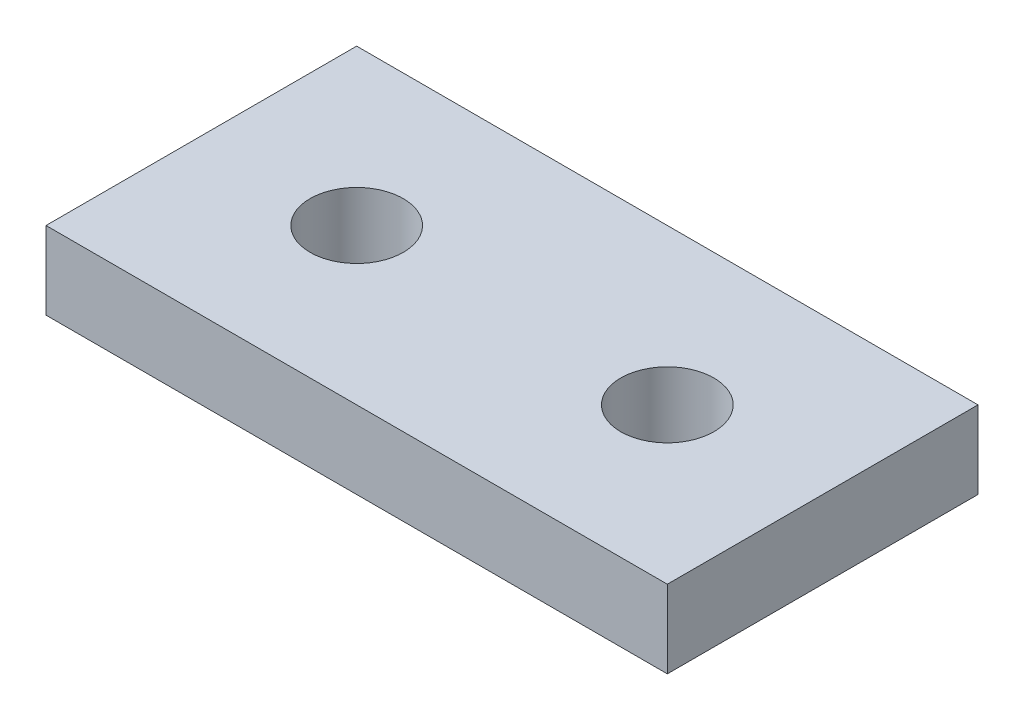
ISO-10303-21;
HEADER;
FILE_DESCRIPTION(('STEP AP214'),'2;1');
FILE_NAME('part.step','',(''),(''),'','','');
FILE_SCHEMA(('AUTOMOTIVE_DESIGN { 1 0 10303 214 1 1 1 1 }'));
ENDSEC;
DATA;
#1=APPLICATION_CONTEXT('core data for automotive mechanical design processes');
#2=APPLICATION_PROTOCOL_DEFINITION('international standard','automotive_design',2000,#1);
#3=PRODUCT_CONTEXT('',#1,'mechanical');
#4=PRODUCT('Part','Part','',(#3));
#5=PRODUCT_RELATED_PRODUCT_CATEGORY('part','',(#4));
#6=PRODUCT_DEFINITION_FORMATION('','',#4);
#7=PRODUCT_DEFINITION_CONTEXT('part definition',#1,'design');
#8=PRODUCT_DEFINITION('design','',#6,#7);
#9=PRODUCT_DEFINITION_SHAPE('','',#8);
#10=(LENGTH_UNIT() NAMED_UNIT(*) SI_UNIT(.MILLI.,.METRE.));
#11=(NAMED_UNIT(*) PLANE_ANGLE_UNIT() SI_UNIT($,.RADIAN.));
#12=(NAMED_UNIT(*) SI_UNIT($,.STERADIAN.) SOLID_ANGLE_UNIT());
#13=UNCERTAINTY_MEASURE_WITH_UNIT(LENGTH_MEASURE(1.E-05),#10,'distance_accuracy_value','');
#14=(GEOMETRIC_REPRESENTATION_CONTEXT(3) GLOBAL_UNCERTAINTY_ASSIGNED_CONTEXT((#13)) GLOBAL_UNIT_ASSIGNED_CONTEXT((#10,
#11,#12)) REPRESENTATION_CONTEXT('',''));
#15=CARTESIAN_POINT('',(0.,0.,0.));
#16=DIRECTION('',(0.,0.,1.));
#17=DIRECTION('',(1.,0.,0.));
#18=AXIS2_PLACEMENT_3D('',#15,#16,#17);
#19=CARTESIAN_POINT('',(0.,5.,0.));
#20=DIRECTION('',(0.,1.,0.));
#21=DIRECTION('',(0.,0.,1.));
#22=AXIS2_PLACEMENT_3D('',#19,#20,#21);
#23=PLANE('',#22);
#24=CARTESIAN_POINT('',(-21.25,5.,2.65625));
#25=DIRECTION('',(0.,1.,0.));
#26=DIRECTION('',(0.,0.,1.));
#27=AXIS2_PLACEMENT_3D('',#24,#25,#26);
#28=CIRCLE('',#27,3.);
#29=CARTESIAN_POINT('',(-21.25,5.,5.65625000000001));
#30=VERTEX_POINT('',#29);
#31=EDGE_CURVE('E100',#30,#30,#28,.T.);
#32=ORIENTED_EDGE('',*,*,#31,.F.);
#33=EDGE_LOOP('',(#32));
#34=FACE_BOUND('',#33,.T.);
#35=DIRECTION('',(0.,0.,1.));
#36=VECTOR('',#35,1.);
#37=CARTESIAN_POINT('',(-31.25,5.,-7.34375));
#38=LINE('',#37,#36);
#39=CARTESIAN_POINT('',(-31.25,5.,-7.34375));
#40=VERTEX_POINT('',#39);
#41=CARTESIAN_POINT('',(-31.25,5.,12.65625));
#42=VERTEX_POINT('',#41);
#43=EDGE_CURVE('E85',#40,#42,#38,.T.);
#44=ORIENTED_EDGE('',*,*,#43,.T.);
#45=DIRECTION('',(1.,0.,0.));
#46=VECTOR('',#45,1.);
#47=CARTESIAN_POINT('',(-31.25,5.,12.65625));
#48=LINE('',#47,#46);
#49=CARTESIAN_POINT('',(8.74999999999997,5.,12.65625));
#50=VERTEX_POINT('',#49);
#51=EDGE_CURVE('E80',#42,#50,#48,.T.);
#52=ORIENTED_EDGE('',*,*,#51,.T.);
#53=DIRECTION('',(0.,0.,-1.));
#54=VECTOR('',#53,1.);
#55=CARTESIAN_POINT('',(8.74999999999997,5.,-7.34375));
#56=LINE('',#55,#54);
#57=CARTESIAN_POINT('',(8.74999999999997,5.,-7.34375));
#58=VERTEX_POINT('',#57);
#59=EDGE_CURVE('E83',#50,#58,#56,.T.);
#60=ORIENTED_EDGE('',*,*,#59,.T.);
#61=DIRECTION('',(-1.,0.,0.));
#62=VECTOR('',#61,1.);
#63=CARTESIAN_POINT('',(-31.25,5.,-7.34375));
#64=LINE('',#63,#62);
#65=EDGE_CURVE('E50',#58,#40,#64,.T.);
#66=ORIENTED_EDGE('',*,*,#65,.T.);
#67=EDGE_LOOP('',(#44,#52,#60,#66));
#68=FACE_BOUND('',#67,.T.);
#69=CARTESIAN_POINT('',(-1.25000000000003,5.,2.65625));
#70=DIRECTION('',(0.,1.,0.));
#71=DIRECTION('',(0.,0.,1.));
#72=AXIS2_PLACEMENT_3D('',#69,#70,#71);
#73=CIRCLE('',#72,3.);
#74=CARTESIAN_POINT('',(-1.25000000000003,5.,5.65625000000001));
#75=VERTEX_POINT('',#74);
#76=EDGE_CURVE('E115',#75,#75,#73,.T.);
#77=ORIENTED_EDGE('',*,*,#76,.F.);
#78=EDGE_LOOP('',(#77));
#79=FACE_BOUND('',#78,.T.);
#80=ADVANCED_FACE('F33',(#34,#68,#79),#23,.T.);
#81=CARTESIAN_POINT('',(0.,0.,0.));
#82=DIRECTION('',(0.,1.,0.));
#83=DIRECTION('',(0.,0.,1.));
#84=AXIS2_PLACEMENT_3D('',#81,#82,#83);
#85=PLANE('',#84);
#86=DIRECTION('',(0.,0.,1.));
#87=VECTOR('',#86,1.);
#88=CARTESIAN_POINT('',(-31.25,0.,-7.34375));
#89=LINE('',#88,#87);
#90=CARTESIAN_POINT('',(-31.25,0.,-7.34375));
#91=VERTEX_POINT('',#90);
#92=CARTESIAN_POINT('',(-31.25,0.,12.65625));
#93=VERTEX_POINT('',#92);
#94=EDGE_CURVE('E97',#91,#93,#89,.T.);
#95=ORIENTED_EDGE('',*,*,#94,.F.);
#96=DIRECTION('',(-1.,0.,0.));
#97=VECTOR('',#96,1.);
#98=CARTESIAN_POINT('',(-31.25,0.,-7.34375));
#99=LINE('',#98,#97);
#100=CARTESIAN_POINT('',(8.74999999999997,0.,-7.34375));
#101=VERTEX_POINT('',#100);
#102=EDGE_CURVE('E73',#101,#91,#99,.T.);
#103=ORIENTED_EDGE('',*,*,#102,.F.);
#104=DIRECTION('',(0.,0.,-1.));
#105=VECTOR('',#104,1.);
#106=CARTESIAN_POINT('',(8.74999999999997,0.,-7.34375));
#107=LINE('',#106,#105);
#108=CARTESIAN_POINT('',(8.74999999999997,0.,12.65625));
#109=VERTEX_POINT('',#108);
#110=EDGE_CURVE('E67',#109,#101,#107,.T.);
#111=ORIENTED_EDGE('',*,*,#110,.F.);
#112=DIRECTION('',(1.,0.,0.));
#113=VECTOR('',#112,1.);
#114=CARTESIAN_POINT('',(-31.25,0.,12.65625));
#115=LINE('',#114,#113);
#116=EDGE_CURVE('E89',#93,#109,#115,.T.);
#117=ORIENTED_EDGE('',*,*,#116,.F.);
#118=EDGE_LOOP('',(#95,#103,#111,#117));
#119=FACE_BOUND('',#118,.T.);
#120=CARTESIAN_POINT('',(-21.25,0.,2.65625));
#121=DIRECTION('',(0.,1.,0.));
#122=DIRECTION('',(0.,0.,1.));
#123=AXIS2_PLACEMENT_3D('',#120,#121,#122);
#124=CIRCLE('',#123,3.);
#125=CARTESIAN_POINT('',(-21.25,0.,5.65625000000001));
#126=VERTEX_POINT('',#125);
#127=EDGE_CURVE('E112',#126,#126,#124,.T.);
#128=ORIENTED_EDGE('',*,*,#127,.T.);
#129=EDGE_LOOP('',(#128));
#130=FACE_BOUND('',#129,.T.);
#131=CARTESIAN_POINT('',(-1.25000000000003,0.,2.65625));
#132=DIRECTION('',(0.,1.,0.));
#133=DIRECTION('',(0.,0.,1.));
#134=AXIS2_PLACEMENT_3D('',#131,#132,#133);
#135=CIRCLE('',#134,3.);
#136=CARTESIAN_POINT('',(-1.25000000000003,0.,5.65625000000001));
#137=VERTEX_POINT('',#136);
#138=EDGE_CURVE('E118',#137,#137,#135,.T.);
#139=ORIENTED_EDGE('',*,*,#138,.T.);
#140=EDGE_LOOP('',(#139));
#141=FACE_BOUND('',#140,.T.);
#142=ADVANCED_FACE('F108',(#119,#130,#141),#85,.F.);
#143=CARTESIAN_POINT('',(-31.25,5.,-7.34375));
#144=DIRECTION('',(1.,0.,0.));
#145=DIRECTION('',(0.,0.,-1.));
#146=AXIS2_PLACEMENT_3D('',#143,#144,#145);
#147=PLANE('',#146);
#148=ORIENTED_EDGE('',*,*,#94,.T.);
#149=DIRECTION('',(0.,-1.,0.));
#150=VECTOR('',#149,1.);
#151=CARTESIAN_POINT('',(-31.25,5.,12.65625));
#152=LINE('',#151,#150);
#153=EDGE_CURVE('E11',#42,#93,#152,.T.);
#154=ORIENTED_EDGE('',*,*,#153,.F.);
#155=ORIENTED_EDGE('',*,*,#43,.F.);
#156=DIRECTION('',(0.,-1.,0.));
#157=VECTOR('',#156,1.);
#158=CARTESIAN_POINT('',(-31.25,5.,-7.34375));
#159=LINE('',#158,#157);
#160=EDGE_CURVE('E93',#40,#91,#159,.T.);
#161=ORIENTED_EDGE('',*,*,#160,.T.);
#162=EDGE_LOOP('',(#148,#154,#155,#161));
#163=FACE_BOUND('',#162,.T.);
#164=ADVANCED_FACE('F35',(#163),#147,.F.);
#165=CARTESIAN_POINT('',(-31.25,5.,12.65625));
#166=DIRECTION('',(0.,0.,-1.));
#167=DIRECTION('',(-1.,0.,0.));
#168=AXIS2_PLACEMENT_3D('',#165,#166,#167);
#169=PLANE('',#168);
#170=ORIENTED_EDGE('',*,*,#116,.T.);
#171=DIRECTION('',(0.,-1.,0.));
#172=VECTOR('',#171,1.);
#173=CARTESIAN_POINT('',(8.74999999999997,5.,12.65625));
#174=LINE('',#173,#172);
#175=EDGE_CURVE('E42',#50,#109,#174,.T.);
#176=ORIENTED_EDGE('',*,*,#175,.F.);
#177=ORIENTED_EDGE('',*,*,#51,.F.);
#178=ORIENTED_EDGE('',*,*,#153,.T.);
#179=EDGE_LOOP('',(#170,#176,#177,#178));
#180=FACE_BOUND('',#179,.T.);
#181=ADVANCED_FACE('F88',(#180),#169,.F.);
#182=CARTESIAN_POINT('',(8.74999999999997,5.,-7.34375));
#183=DIRECTION('',(-1.,0.,0.));
#184=DIRECTION('',(0.,0.,1.));
#185=AXIS2_PLACEMENT_3D('',#182,#183,#184);
#186=PLANE('',#185);
#187=ORIENTED_EDGE('',*,*,#110,.T.);
#188=DIRECTION('',(0.,-1.,0.));
#189=VECTOR('',#188,1.);
#190=CARTESIAN_POINT('',(8.74999999999997,5.,-7.34375));
#191=LINE('',#190,#189);
#192=EDGE_CURVE('E90',#58,#101,#191,.T.);
#193=ORIENTED_EDGE('',*,*,#192,.F.);
#194=ORIENTED_EDGE('',*,*,#59,.F.);
#195=ORIENTED_EDGE('',*,*,#175,.T.);
#196=EDGE_LOOP('',(#187,#193,#194,#195));
#197=FACE_BOUND('',#196,.T.);
#198=ADVANCED_FACE('F91',(#197),#186,.F.);
#199=CARTESIAN_POINT('',(-31.25,5.,-7.34375));
#200=DIRECTION('',(0.,0.,1.));
#201=DIRECTION('',(1.,0.,0.));
#202=AXIS2_PLACEMENT_3D('',#199,#200,#201);
#203=PLANE('',#202);
#204=ORIENTED_EDGE('',*,*,#102,.T.);
#205=ORIENTED_EDGE('',*,*,#160,.F.);
#206=ORIENTED_EDGE('',*,*,#65,.F.);
#207=ORIENTED_EDGE('',*,*,#192,.T.);
#208=EDGE_LOOP('',(#204,#205,#206,#207));
#209=FACE_BOUND('',#208,.T.);
#210=ADVANCED_FACE('F105',(#209),#203,.F.);
#211=CARTESIAN_POINT('',(-21.25,5.,2.65625));
#212=DIRECTION('',(0.,-1.,0.));
#213=DIRECTION('',(0.,0.,-1.));
#214=AXIS2_PLACEMENT_3D('',#211,#212,#213);
#215=CYLINDRICAL_SURFACE('',#214,3.);
#216=ORIENTED_EDGE('',*,*,#31,.T.);
#217=EDGE_LOOP('',(#216));
#218=FACE_BOUND('',#217,.T.);
#219=ORIENTED_EDGE('',*,*,#127,.F.);
#220=EDGE_LOOP('',(#219));
#221=FACE_BOUND('',#220,.T.);
#222=ADVANCED_FACE('F135',(#218,#221),#215,.F.);
#223=CARTESIAN_POINT('',(-1.25000000000003,5.,2.65625));
#224=DIRECTION('',(0.,-1.,0.));
#225=DIRECTION('',(0.,0.,-1.));
#226=AXIS2_PLACEMENT_3D('',#223,#224,#225);
#227=CYLINDRICAL_SURFACE('',#226,3.);
#228=ORIENTED_EDGE('',*,*,#76,.T.);
#229=EDGE_LOOP('',(#228));
#230=FACE_BOUND('',#229,.T.);
#231=ORIENTED_EDGE('',*,*,#138,.F.);
#232=EDGE_LOOP('',(#231));
#233=FACE_BOUND('',#232,.T.);
#234=ADVANCED_FACE('F124',(#230,#233),#227,.F.);
#235=CLOSED_SHELL('',(#80,#142,#164,#181,#198,#210,#222,#234));
#236=MANIFOLD_SOLID_BREP('B2',#235);
#237=ADVANCED_BREP_SHAPE_REPRESENTATION('',(#18,#236),#14);
#238=SHAPE_DEFINITION_REPRESENTATION(#9,#237);
ENDSEC;
END-ISO-10303-21;
